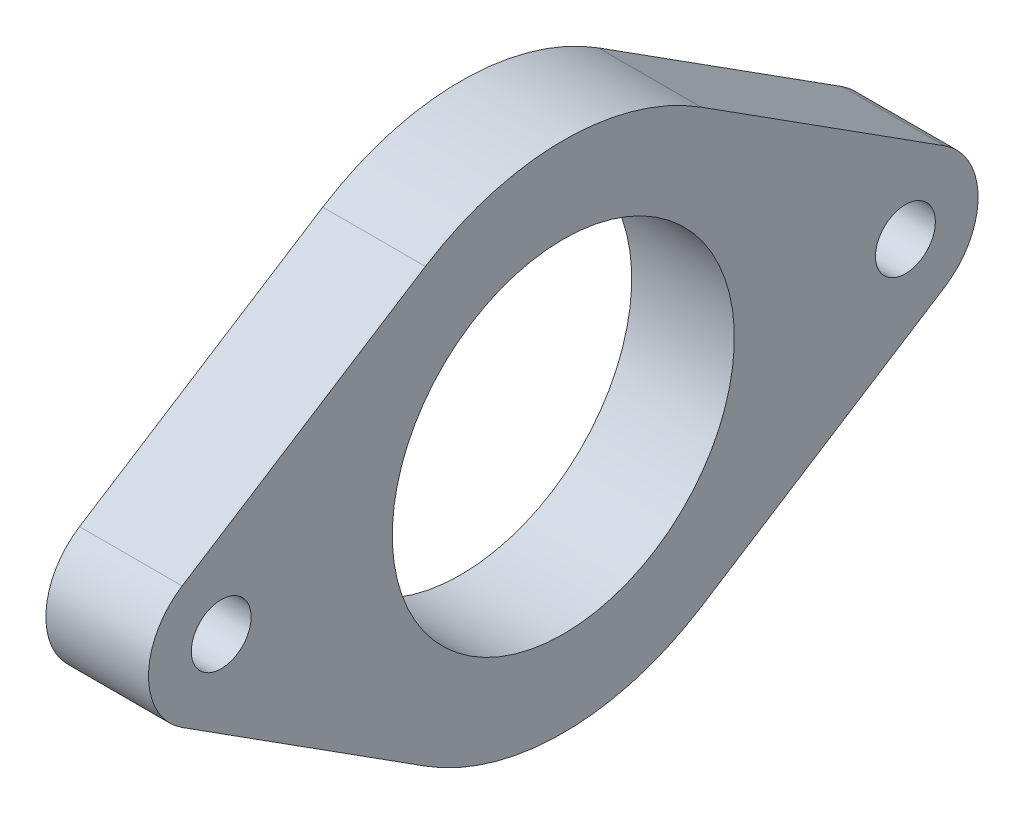
ISO-10303-21;
HEADER;
FILE_DESCRIPTION(('STEP AP214'),'2;1');
FILE_NAME('part.step','',(''),(''),'','','');
FILE_SCHEMA(('AUTOMOTIVE_DESIGN { 1 0 10303 214 1 1 1 1 }'));
ENDSEC;
DATA;
#1=APPLICATION_CONTEXT('core data for automotive mechanical design processes');
#2=APPLICATION_PROTOCOL_DEFINITION('international standard','automotive_design',2000,#1);
#3=PRODUCT_CONTEXT('',#1,'mechanical');
#4=PRODUCT('Part','Part','',(#3));
#5=PRODUCT_RELATED_PRODUCT_CATEGORY('part','',(#4));
#6=PRODUCT_DEFINITION_FORMATION('','',#4);
#7=PRODUCT_DEFINITION_CONTEXT('part definition',#1,'design');
#8=PRODUCT_DEFINITION('design','',#6,#7);
#9=PRODUCT_DEFINITION_SHAPE('','',#8);
#10=(LENGTH_UNIT() NAMED_UNIT(*) SI_UNIT(.MILLI.,.METRE.));
#11=(NAMED_UNIT(*) PLANE_ANGLE_UNIT() SI_UNIT($,.RADIAN.));
#12=(NAMED_UNIT(*) SI_UNIT($,.STERADIAN.) SOLID_ANGLE_UNIT());
#13=UNCERTAINTY_MEASURE_WITH_UNIT(LENGTH_MEASURE(1.E-05),#10,'distance_accuracy_value','');
#14=(GEOMETRIC_REPRESENTATION_CONTEXT(3) GLOBAL_UNCERTAINTY_ASSIGNED_CONTEXT((#13)) GLOBAL_UNIT_ASSIGNED_CONTEXT((#10,
#11,#12)) REPRESENTATION_CONTEXT('',''));
#15=CARTESIAN_POINT('',(0.,0.,0.));
#16=DIRECTION('',(0.,0.,1.));
#17=DIRECTION('',(1.,0.,0.));
#18=AXIS2_PLACEMENT_3D('',#15,#16,#17);
#19=CARTESIAN_POINT('',(3.,0.,0.));
#20=DIRECTION('',(1.,0.,0.));
#21=DIRECTION('',(0.,1.,0.));
#22=AXIS2_PLACEMENT_3D('',#19,#20,#21);
#23=PLANE('',#22);
#24=CARTESIAN_POINT('',(3.,0.,-20.));
#25=DIRECTION('',(-1.,0.,0.));
#26=DIRECTION('',(0.,-1.,0.));
#27=AXIS2_PLACEMENT_3D('',#24,#25,#26);
#28=CIRCLE('',#27,1.75);
#29=CARTESIAN_POINT('',(3.,1.75,-20.));
#30=VERTEX_POINT('',#29);
#31=EDGE_CURVE('E180',#30,#30,#28,.T.);
#32=ORIENTED_EDGE('',*,*,#31,.T.);
#33=EDGE_LOOP('',(#32));
#34=FACE_BOUND('',#33,.T.);
#35=CARTESIAN_POINT('',(3.,0.,20.));
#36=DIRECTION('',(-1.,0.,0.));
#37=DIRECTION('',(0.,-1.,0.));
#38=AXIS2_PLACEMENT_3D('',#35,#36,#37);
#39=CIRCLE('',#38,1.75);
#40=CARTESIAN_POINT('',(3.,1.75,20.));
#41=VERTEX_POINT('',#40);
#42=EDGE_CURVE('E167',#41,#41,#39,.T.);
#43=ORIENTED_EDGE('',*,*,#42,.T.);
#44=EDGE_LOOP('',(#43));
#45=FACE_BOUND('',#44,.T.);
#46=CARTESIAN_POINT('',(3.,0.,0.));
#47=DIRECTION('',(-1.,0.,0.));
#48=DIRECTION('',(0.,-1.,0.));
#49=AXIS2_PLACEMENT_3D('',#46,#47,#48);
#50=CIRCLE('',#49,10.);
#51=CARTESIAN_POINT('',(3.,10.,0.));
#52=VERTEX_POINT('',#51);
#53=EDGE_CURVE('E177',#52,#52,#50,.T.);
#54=ORIENTED_EDGE('',*,*,#53,.T.);
#55=EDGE_LOOP('',(#54));
#56=FACE_BOUND('',#55,.T.);
#57=CARTESIAN_POINT('',(3.,0.,20.));
#58=DIRECTION('',(1.,0.,0.));
#59=DIRECTION('',(0.,1.,0.));
#60=AXIS2_PLACEMENT_3D('',#57,#58,#59);
#61=CIRCLE('',#60,4.25);
#62=CARTESIAN_POINT('',(3.,3.58387093229862,22.284375));
#63=VERTEX_POINT('',#62);
#64=CARTESIAN_POINT('',(3.,-3.58387093229863,22.284375));
#65=VERTEX_POINT('',#64);
#66=EDGE_CURVE('E11',#63,#65,#61,.T.);
#67=ORIENTED_EDGE('',*,*,#66,.T.);
#68=DIRECTION('',(0.,-0.5375,-0.843263748776147));
#69=VECTOR('',#68,1.);
#70=CARTESIAN_POINT('',(3.,-3.58387093229863,22.284375));
#71=LINE('',#70,#69);
#72=CARTESIAN_POINT('',(3.,-12.6489562316422,8.0625));
#73=VERTEX_POINT('',#72);
#74=EDGE_CURVE('E185',#65,#73,#71,.T.);
#75=ORIENTED_EDGE('',*,*,#74,.T.);
#76=CARTESIAN_POINT('',(3.,0.,0.));
#77=DIRECTION('',(1.,0.,0.));
#78=DIRECTION('',(0.,1.,0.));
#79=AXIS2_PLACEMENT_3D('',#76,#77,#78);
#80=CIRCLE('',#79,15.);
#81=CARTESIAN_POINT('',(3.,-12.6489562316422,-8.0625));
#82=VERTEX_POINT('',#81);
#83=EDGE_CURVE('E156',#73,#82,#80,.T.);
#84=ORIENTED_EDGE('',*,*,#83,.T.);
#85=DIRECTION('',(0.,0.5375,-0.843263748776147));
#86=VECTOR('',#85,1.);
#87=CARTESIAN_POINT('',(3.,-12.6489562316422,-8.0625));
#88=LINE('',#87,#86);
#89=CARTESIAN_POINT('',(3.,-3.58387093229863,-22.284375));
#90=VERTEX_POINT('',#89);
#91=EDGE_CURVE('E125',#82,#90,#88,.T.);
#92=ORIENTED_EDGE('',*,*,#91,.T.);
#93=CARTESIAN_POINT('',(3.,0.,-20.));
#94=DIRECTION('',(1.,0.,0.));
#95=DIRECTION('',(0.,1.,0.));
#96=AXIS2_PLACEMENT_3D('',#93,#94,#95);
#97=CIRCLE('',#96,4.25);
#98=CARTESIAN_POINT('',(3.,3.58387093229862,-22.284375));
#99=VERTEX_POINT('',#98);
#100=EDGE_CURVE('E119',#90,#99,#97,.T.);
#101=ORIENTED_EDGE('',*,*,#100,.T.);
#102=DIRECTION('',(0.,0.5375,0.843263748776147));
#103=VECTOR('',#102,1.);
#104=CARTESIAN_POINT('',(3.,3.58387093229862,-22.284375));
#105=LINE('',#104,#103);
#106=CARTESIAN_POINT('',(3.,12.6489562316422,-8.0625));
#107=VERTEX_POINT('',#106);
#108=EDGE_CURVE('E122',#99,#107,#105,.T.);
#109=ORIENTED_EDGE('',*,*,#108,.T.);
#110=CARTESIAN_POINT('',(3.,0.,0.));
#111=DIRECTION('',(1.,0.,0.));
#112=DIRECTION('',(0.,1.,0.));
#113=AXIS2_PLACEMENT_3D('',#110,#111,#112);
#114=CIRCLE('',#113,15.);
#115=CARTESIAN_POINT('',(3.,12.6489562316422,8.0625));
#116=VERTEX_POINT('',#115);
#117=EDGE_CURVE('E150',#107,#116,#114,.T.);
#118=ORIENTED_EDGE('',*,*,#117,.T.);
#119=DIRECTION('',(0.,-0.5375,0.843263748776147));
#120=VECTOR('',#119,1.);
#121=CARTESIAN_POINT('',(3.,12.6489562316422,8.0625));
#122=LINE('',#121,#120);
#123=EDGE_CURVE('E202',#116,#63,#122,.T.);
#124=ORIENTED_EDGE('',*,*,#123,.T.);
#125=EDGE_LOOP('',(#67,#75,#84,#92,#101,#109,#118,#124));
#126=FACE_BOUND('',#125,.T.);
#127=ADVANCED_FACE('F16',(#34,#45,#56,#126),#23,.T.);
#128=CARTESIAN_POINT('',(0.,0.,20.));
#129=DIRECTION('',(1.,0.,0.));
#130=DIRECTION('',(0.,1.,0.));
#131=AXIS2_PLACEMENT_3D('',#128,#129,#130);
#132=CYLINDRICAL_SURFACE('',#131,4.25);
#133=DIRECTION('',(1.,0.,0.));
#134=VECTOR('',#133,1.);
#135=CARTESIAN_POINT('',(0.,-3.58387093229863,22.284375));
#136=LINE('',#135,#134);
#137=CARTESIAN_POINT('',(-3.,-3.58387093229863,22.284375));
#138=VERTEX_POINT('',#137);
#139=EDGE_CURVE('E27',#138,#65,#136,.T.);
#140=ORIENTED_EDGE('',*,*,#139,.T.);
#141=ORIENTED_EDGE('',*,*,#66,.F.);
#142=DIRECTION('',(-1.,0.,0.));
#143=VECTOR('',#142,1.);
#144=CARTESIAN_POINT('',(0.,3.58387093229862,22.284375));
#145=LINE('',#144,#143);
#146=CARTESIAN_POINT('',(-3.,3.58387093229862,22.284375));
#147=VERTEX_POINT('',#146);
#148=EDGE_CURVE('E176',#63,#147,#145,.T.);
#149=ORIENTED_EDGE('',*,*,#148,.T.);
#150=CARTESIAN_POINT('',(-3.,0.,20.));
#151=DIRECTION('',(-1.,0.,0.));
#152=DIRECTION('',(0.,1.,0.));
#153=AXIS2_PLACEMENT_3D('',#150,#151,#152);
#154=CIRCLE('',#153,4.25);
#155=EDGE_CURVE('E199',#138,#147,#154,.T.);
#156=ORIENTED_EDGE('',*,*,#155,.F.);
#157=EDGE_LOOP('',(#140,#141,#149,#156));
#158=FACE_BOUND('',#157,.T.);
#159=ADVANCED_FACE('F231',(#158),#132,.T.);
#160=CARTESIAN_POINT('',(0.,-3.58387093229863,22.284375));
#161=DIRECTION('',(0.,-0.843263748776147,0.5375));
#162=DIRECTION('',(-1.,0.,0.));
#163=AXIS2_PLACEMENT_3D('',#160,#161,#162);
#164=PLANE('',#163);
#165=DIRECTION('',(1.,0.,0.));
#166=VECTOR('',#165,1.);
#167=CARTESIAN_POINT('',(0.,-12.6489562316422,8.0625));
#168=LINE('',#167,#166);
#169=CARTESIAN_POINT('',(-3.,-12.6489562316422,8.0625));
#170=VERTEX_POINT('',#169);
#171=EDGE_CURVE('E159',#170,#73,#168,.T.);
#172=ORIENTED_EDGE('',*,*,#171,.T.);
#173=ORIENTED_EDGE('',*,*,#74,.F.);
#174=ORIENTED_EDGE('',*,*,#139,.F.);
#175=DIRECTION('',(0.,0.5375,0.843263748776147));
#176=VECTOR('',#175,1.);
#177=CARTESIAN_POINT('',(-3.,-3.58387093229863,22.284375));
#178=LINE('',#177,#176);
#179=EDGE_CURVE('E161',#170,#138,#178,.T.);
#180=ORIENTED_EDGE('',*,*,#179,.F.);
#181=EDGE_LOOP('',(#172,#173,#174,#180));
#182=FACE_BOUND('',#181,.T.);
#183=ADVANCED_FACE('F280',(#182),#164,.T.);
#184=CARTESIAN_POINT('',(0.,0.,0.));
#185=DIRECTION('',(1.,0.,0.));
#186=DIRECTION('',(0.,-1.,0.));
#187=AXIS2_PLACEMENT_3D('',#184,#185,#186);
#188=CYLINDRICAL_SURFACE('',#187,15.);
#189=DIRECTION('',(1.,0.,0.));
#190=VECTOR('',#189,1.);
#191=CARTESIAN_POINT('',(0.,-12.6489562316422,-8.0625));
#192=LINE('',#191,#190);
#193=CARTESIAN_POINT('',(-3.,-12.6489562316422,-8.0625));
#194=VERTEX_POINT('',#193);
#195=EDGE_CURVE('E160',#194,#82,#192,.T.);
#196=ORIENTED_EDGE('',*,*,#195,.T.);
#197=ORIENTED_EDGE('',*,*,#83,.F.);
#198=ORIENTED_EDGE('',*,*,#171,.F.);
#199=CARTESIAN_POINT('',(-3.,0.,0.));
#200=DIRECTION('',(-1.,0.,0.));
#201=DIRECTION('',(0.,1.,0.));
#202=AXIS2_PLACEMENT_3D('',#199,#200,#201);
#203=CIRCLE('',#202,15.);
#204=EDGE_CURVE('E166',#194,#170,#203,.T.);
#205=ORIENTED_EDGE('',*,*,#204,.F.);
#206=EDGE_LOOP('',(#196,#197,#198,#205));
#207=FACE_BOUND('',#206,.T.);
#208=ADVANCED_FACE('F290',(#207),#188,.T.);
#209=CARTESIAN_POINT('',(0.,-12.6489562316422,-8.0625));
#210=DIRECTION('',(0.,-0.843263748776147,-0.5375));
#211=DIRECTION('',(0.,0.5375,-0.843263748776147));
#212=AXIS2_PLACEMENT_3D('',#209,#210,#211);
#213=PLANE('',#212);
#214=DIRECTION('',(1.,0.,0.));
#215=VECTOR('',#214,1.);
#216=CARTESIAN_POINT('',(0.,-3.58387093229863,-22.284375));
#217=LINE('',#216,#215);
#218=CARTESIAN_POINT('',(-3.,-3.58387093229863,-22.284375));
#219=VERTEX_POINT('',#218);
#220=EDGE_CURVE('E129',#219,#90,#217,.T.);
#221=ORIENTED_EDGE('',*,*,#220,.T.);
#222=ORIENTED_EDGE('',*,*,#91,.F.);
#223=ORIENTED_EDGE('',*,*,#195,.F.);
#224=DIRECTION('',(0.,-0.5375,0.843263748776147));
#225=VECTOR('',#224,1.);
#226=CARTESIAN_POINT('',(-3.,-12.6489562316422,-8.0625));
#227=LINE('',#226,#225);
#228=EDGE_CURVE('E193',#219,#194,#227,.T.);
#229=ORIENTED_EDGE('',*,*,#228,.F.);
#230=EDGE_LOOP('',(#221,#222,#223,#229));
#231=FACE_BOUND('',#230,.T.);
#232=ADVANCED_FACE('F285',(#231),#213,.T.);
#233=CARTESIAN_POINT('',(0.,0.,-20.));
#234=DIRECTION('',(1.,0.,0.));
#235=DIRECTION('',(0.,1.,0.));
#236=AXIS2_PLACEMENT_3D('',#233,#234,#235);
#237=CYLINDRICAL_SURFACE('',#236,4.25);
#238=DIRECTION('',(1.,0.,0.));
#239=VECTOR('',#238,1.);
#240=CARTESIAN_POINT('',(0.,3.58387093229862,-22.284375));
#241=LINE('',#240,#239);
#242=CARTESIAN_POINT('',(-3.,3.58387093229862,-22.284375));
#243=VERTEX_POINT('',#242);
#244=EDGE_CURVE('E130',#243,#99,#241,.T.);
#245=ORIENTED_EDGE('',*,*,#244,.T.);
#246=ORIENTED_EDGE('',*,*,#100,.F.);
#247=ORIENTED_EDGE('',*,*,#220,.F.);
#248=CARTESIAN_POINT('',(-3.,0.,-20.));
#249=DIRECTION('',(-1.,0.,0.));
#250=DIRECTION('',(0.,1.,0.));
#251=AXIS2_PLACEMENT_3D('',#248,#249,#250);
#252=CIRCLE('',#251,4.25);
#253=EDGE_CURVE('E135',#243,#219,#252,.T.);
#254=ORIENTED_EDGE('',*,*,#253,.F.);
#255=EDGE_LOOP('',(#245,#246,#247,#254));
#256=FACE_BOUND('',#255,.T.);
#257=ADVANCED_FACE('F133',(#256),#237,.T.);
#258=CARTESIAN_POINT('',(0.,3.58387093229862,-22.284375));
#259=DIRECTION('',(0.,0.843263748776147,-0.5375));
#260=DIRECTION('',(-1.,0.,0.));
#261=AXIS2_PLACEMENT_3D('',#258,#259,#260);
#262=PLANE('',#261);
#263=DIRECTION('',(1.,0.,0.));
#264=VECTOR('',#263,1.);
#265=CARTESIAN_POINT('',(0.,12.6489562316422,-8.0625));
#266=LINE('',#265,#264);
#267=CARTESIAN_POINT('',(-3.,12.6489562316422,-8.0625));
#268=VERTEX_POINT('',#267);
#269=EDGE_CURVE('E142',#268,#107,#266,.T.);
#270=ORIENTED_EDGE('',*,*,#269,.T.);
#271=ORIENTED_EDGE('',*,*,#108,.F.);
#272=ORIENTED_EDGE('',*,*,#244,.F.);
#273=DIRECTION('',(0.,-0.5375,-0.843263748776147));
#274=VECTOR('',#273,1.);
#275=CARTESIAN_POINT('',(-3.,3.58387093229862,-22.284375));
#276=LINE('',#275,#274);
#277=EDGE_CURVE('E20',#268,#243,#276,.T.);
#278=ORIENTED_EDGE('',*,*,#277,.F.);
#279=EDGE_LOOP('',(#270,#271,#272,#278));
#280=FACE_BOUND('',#279,.T.);
#281=ADVANCED_FACE('F141',(#280),#262,.T.);
#282=CARTESIAN_POINT('',(0.,0.,0.));
#283=DIRECTION('',(1.,0.,0.));
#284=DIRECTION('',(0.,1.,0.));
#285=AXIS2_PLACEMENT_3D('',#282,#283,#284);
#286=CYLINDRICAL_SURFACE('',#285,15.);
#287=DIRECTION('',(1.,0.,0.));
#288=VECTOR('',#287,1.);
#289=CARTESIAN_POINT('',(0.,12.6489562316422,8.0625));
#290=LINE('',#289,#288);
#291=CARTESIAN_POINT('',(-3.,12.6489562316422,8.0625));
#292=VERTEX_POINT('',#291);
#293=EDGE_CURVE('E205',#292,#116,#290,.T.);
#294=ORIENTED_EDGE('',*,*,#293,.T.);
#295=ORIENTED_EDGE('',*,*,#117,.F.);
#296=ORIENTED_EDGE('',*,*,#269,.F.);
#297=CARTESIAN_POINT('',(-3.,0.,0.));
#298=DIRECTION('',(-1.,0.,0.));
#299=DIRECTION('',(0.,1.,0.));
#300=AXIS2_PLACEMENT_3D('',#297,#298,#299);
#301=CIRCLE('',#300,15.);
#302=EDGE_CURVE('E154',#292,#268,#301,.T.);
#303=ORIENTED_EDGE('',*,*,#302,.F.);
#304=EDGE_LOOP('',(#294,#295,#296,#303));
#305=FACE_BOUND('',#304,.T.);
#306=ADVANCED_FACE('F18',(#305),#286,.T.);
#307=CARTESIAN_POINT('',(0.,12.6489562316422,8.0625));
#308=DIRECTION('',(0.,0.843263748776147,0.5375));
#309=DIRECTION('',(1.,0.,0.));
#310=AXIS2_PLACEMENT_3D('',#307,#308,#309);
#311=PLANE('',#310);
#312=ORIENTED_EDGE('',*,*,#148,.F.);
#313=ORIENTED_EDGE('',*,*,#123,.F.);
#314=ORIENTED_EDGE('',*,*,#293,.F.);
#315=DIRECTION('',(0.,0.5375,-0.843263748776147));
#316=VECTOR('',#315,1.);
#317=CARTESIAN_POINT('',(-3.,12.6489562316422,8.0625));
#318=LINE('',#317,#316);
#319=EDGE_CURVE('E195',#147,#292,#318,.T.);
#320=ORIENTED_EDGE('',*,*,#319,.F.);
#321=EDGE_LOOP('',(#312,#313,#314,#320));
#322=FACE_BOUND('',#321,.T.);
#323=ADVANCED_FACE('F236',(#322),#311,.T.);
#324=CARTESIAN_POINT('',(0.,0.,0.));
#325=DIRECTION('',(1.,0.,0.));
#326=DIRECTION('',(0.,-1.,0.));
#327=AXIS2_PLACEMENT_3D('',#324,#325,#326);
#328=CYLINDRICAL_SURFACE('',#327,10.);
#329=ORIENTED_EDGE('',*,*,#53,.F.);
#330=DIRECTION('',(-1.,0.,0.));
#331=VECTOR('',#330,1.);
#332=CARTESIAN_POINT('',(0.,10.,0.));
#333=LINE('',#332,#331);
#334=CARTESIAN_POINT('',(-3.,10.,0.));
#335=VERTEX_POINT('',#334);
#336=EDGE_CURVE('E173',#52,#335,#333,.T.);
#337=ORIENTED_EDGE('',*,*,#336,.T.);
#338=CARTESIAN_POINT('',(-3.,0.,0.));
#339=DIRECTION('',(1.,0.,0.));
#340=DIRECTION('',(0.,-1.,0.));
#341=AXIS2_PLACEMENT_3D('',#338,#339,#340);
#342=CIRCLE('',#341,10.);
#343=EDGE_CURVE('E165',#335,#335,#342,.T.);
#344=ORIENTED_EDGE('',*,*,#343,.F.);
#345=ORIENTED_EDGE('',*,*,#336,.F.);
#346=EDGE_LOOP('',(#329,#337,#344,#345));
#347=FACE_BOUND('',#346,.T.);
#348=ADVANCED_FACE('F271',(#347),#328,.F.);
#349=CARTESIAN_POINT('',(0.,0.,20.));
#350=DIRECTION('',(1.,0.,0.));
#351=DIRECTION('',(0.,-1.,0.));
#352=AXIS2_PLACEMENT_3D('',#349,#350,#351);
#353=CYLINDRICAL_SURFACE('',#352,1.75);
#354=ORIENTED_EDGE('',*,*,#42,.F.);
#355=DIRECTION('',(-1.,0.,0.));
#356=VECTOR('',#355,1.);
#357=CARTESIAN_POINT('',(0.,1.75,20.));
#358=LINE('',#357,#356);
#359=CARTESIAN_POINT('',(-3.,1.75,20.));
#360=VERTEX_POINT('',#359);
#361=EDGE_CURVE('E171',#41,#360,#358,.T.);
#362=ORIENTED_EDGE('',*,*,#361,.T.);
#363=CARTESIAN_POINT('',(-3.,0.,20.));
#364=DIRECTION('',(1.,0.,0.));
#365=DIRECTION('',(0.,-1.,0.));
#366=AXIS2_PLACEMENT_3D('',#363,#364,#365);
#367=CIRCLE('',#366,1.75);
#368=EDGE_CURVE('E211',#360,#360,#367,.T.);
#369=ORIENTED_EDGE('',*,*,#368,.F.);
#370=ORIENTED_EDGE('',*,*,#361,.F.);
#371=EDGE_LOOP('',(#354,#362,#369,#370));
#372=FACE_BOUND('',#371,.T.);
#373=ADVANCED_FACE('F303',(#372),#353,.F.);
#374=CARTESIAN_POINT('',(0.,0.,-20.));
#375=DIRECTION('',(1.,0.,0.));
#376=DIRECTION('',(0.,-1.,0.));
#377=AXIS2_PLACEMENT_3D('',#374,#375,#376);
#378=CYLINDRICAL_SURFACE('',#377,1.75);
#379=ORIENTED_EDGE('',*,*,#31,.F.);
#380=DIRECTION('',(-1.,0.,0.));
#381=VECTOR('',#380,1.);
#382=CARTESIAN_POINT('',(0.,1.75,-20.));
#383=LINE('',#382,#381);
#384=CARTESIAN_POINT('',(-3.,1.75,-20.));
#385=VERTEX_POINT('',#384);
#386=EDGE_CURVE('E172',#30,#385,#383,.T.);
#387=ORIENTED_EDGE('',*,*,#386,.T.);
#388=CARTESIAN_POINT('',(-3.,0.,-20.));
#389=DIRECTION('',(1.,0.,0.));
#390=DIRECTION('',(0.,-1.,0.));
#391=AXIS2_PLACEMENT_3D('',#388,#389,#390);
#392=CIRCLE('',#391,1.75);
#393=EDGE_CURVE('E215',#385,#385,#392,.T.);
#394=ORIENTED_EDGE('',*,*,#393,.F.);
#395=ORIENTED_EDGE('',*,*,#386,.F.);
#396=EDGE_LOOP('',(#379,#387,#394,#395));
#397=FACE_BOUND('',#396,.T.);
#398=ADVANCED_FACE('F288',(#397),#378,.F.);
#399=CARTESIAN_POINT('',(-3.,0.,0.));
#400=DIRECTION('',(1.,0.,0.));
#401=DIRECTION('',(0.,1.,0.));
#402=AXIS2_PLACEMENT_3D('',#399,#400,#401);
#403=PLANE('',#402);
#404=ORIENTED_EDGE('',*,*,#393,.T.);
#405=EDGE_LOOP('',(#404));
#406=FACE_BOUND('',#405,.T.);
#407=ORIENTED_EDGE('',*,*,#368,.T.);
#408=EDGE_LOOP('',(#407));
#409=FACE_BOUND('',#408,.T.);
#410=ORIENTED_EDGE('',*,*,#343,.T.);
#411=EDGE_LOOP('',(#410));
#412=FACE_BOUND('',#411,.T.);
#413=ORIENTED_EDGE('',*,*,#155,.T.);
#414=ORIENTED_EDGE('',*,*,#319,.T.);
#415=ORIENTED_EDGE('',*,*,#302,.T.);
#416=ORIENTED_EDGE('',*,*,#277,.T.);
#417=ORIENTED_EDGE('',*,*,#253,.T.);
#418=ORIENTED_EDGE('',*,*,#228,.T.);
#419=ORIENTED_EDGE('',*,*,#204,.T.);
#420=ORIENTED_EDGE('',*,*,#179,.T.);
#421=EDGE_LOOP('',(#413,#414,#415,#416,#417,#418,#419,#420));
#422=FACE_BOUND('',#421,.T.);
#423=ADVANCED_FACE('F226',(#406,#409,#412,#422),#403,.F.);
#424=CLOSED_SHELL('',(#127,#159,#183,#208,#232,#257,#281,#306,#323,#348,#373,#398,#423));
#425=MANIFOLD_SOLID_BREP('B1',#424);
#426=ADVANCED_BREP_SHAPE_REPRESENTATION('',(#18,#425),#14);
#427=SHAPE_DEFINITION_REPRESENTATION(#9,#426);
ENDSEC;
END-ISO-10303-21;
